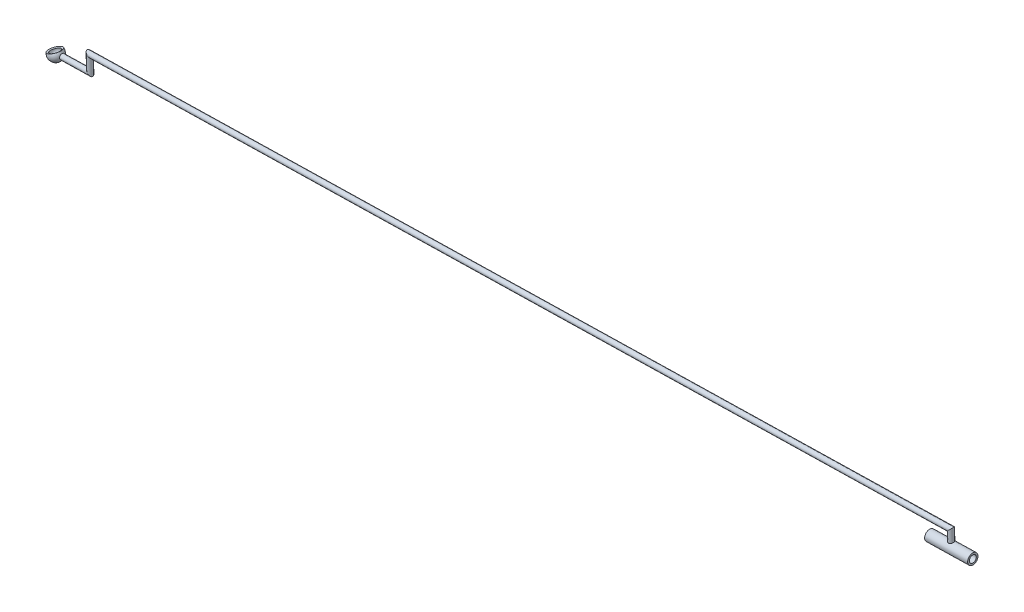
ISO-10303-21;
HEADER;
FILE_DESCRIPTION(('STEP AP214'),'2;1');
FILE_NAME('part.step','',(''),(''),'','','');
FILE_SCHEMA(('AUTOMOTIVE_DESIGN { 1 0 10303 214 1 1 1 1 }'));
ENDSEC;
DATA;
#1=APPLICATION_CONTEXT('core data for automotive mechanical design processes');
#2=APPLICATION_PROTOCOL_DEFINITION('international standard','automotive_design',2000,#1);
#3=PRODUCT_CONTEXT('',#1,'mechanical');
#4=PRODUCT('Part','Part','',(#3));
#5=PRODUCT_RELATED_PRODUCT_CATEGORY('part','',(#4));
#6=PRODUCT_DEFINITION_FORMATION('','',#4);
#7=PRODUCT_DEFINITION_CONTEXT('part definition',#1,'design');
#8=PRODUCT_DEFINITION('design','',#6,#7);
#9=PRODUCT_DEFINITION_SHAPE('','',#8);
#10=(LENGTH_UNIT() NAMED_UNIT(*) SI_UNIT(.MILLI.,.METRE.));
#11=(NAMED_UNIT(*) PLANE_ANGLE_UNIT() SI_UNIT($,.RADIAN.));
#12=(NAMED_UNIT(*) SI_UNIT($,.STERADIAN.) SOLID_ANGLE_UNIT());
#13=UNCERTAINTY_MEASURE_WITH_UNIT(LENGTH_MEASURE(1.E-05),#10,'distance_accuracy_value','');
#14=(GEOMETRIC_REPRESENTATION_CONTEXT(3) GLOBAL_UNCERTAINTY_ASSIGNED_CONTEXT((#13)) GLOBAL_UNIT_ASSIGNED_CONTEXT((#10,
#11,#12)) REPRESENTATION_CONTEXT('',''));
#15=CARTESIAN_POINT('',(0.,0.,0.));
#16=DIRECTION('',(0.,0.,1.));
#17=DIRECTION('',(1.,0.,0.));
#18=AXIS2_PLACEMENT_3D('',#15,#16,#17);
#19=CARTESIAN_POINT('',(-968.763398119366,-169.458929981982,0.));
#20=DIRECTION('',(-0.999750901456538,-0.0223189389720978,0.));
#21=DIRECTION('',(0.0223189389720978,-0.999750901456538,0.));
#22=AXIS2_PLACEMENT_3D('',#19,#20,#21);
#23=CYLINDRICAL_SURFACE('',#22,1.5);
#24=CARTESIAN_POINT('',(-973.004981970869,-169.553621220558,0.));
#25=DIRECTION('',(0.691148768821226,0.722712515013337,0.));
#26=DIRECTION('',(-0.722712515013337,0.691148768821226,0.));
#27=AXIS2_PLACEMENT_3D('',#24,#25,#26);
#28=ELLIPSE('',#27,2.12132034355963,1.5);
#29=CARTESIAN_POINT('',(-974.538086731512,-168.087473276831,0.));
#30=VERTEX_POINT('',#29);
#31=EDGE_CURVE('E64',#30,#30,#28,.T.);
#32=ORIENTED_EDGE('',*,*,#31,.F.);
#33=EDGE_LOOP('',(#32));
#34=FACE_BOUND('',#33,.T.);
#35=CARTESIAN_POINT('',(-989.292824438573,-169.917239159281,0.));
#36=DIRECTION('',(-0.999750901456547,-0.0223189389720992,0.));
#37=DIRECTION('',(0.022318938972099,-0.999750901456538,0.));
#38=AXIS2_PLACEMENT_3D('',#35,#36,#37);
#39=CIRCLE('',#38,1.5);
#40=CARTESIAN_POINT('',(-989.259346030114,-171.416865511466,0.));
#41=VERTEX_POINT('',#40);
#42=EDGE_CURVE('E12',#41,#41,#39,.T.);
#43=ORIENTED_EDGE('',*,*,#42,.F.);
#44=EDGE_LOOP('',(#43));
#45=FACE_BOUND('',#44,.T.);
#46=ADVANCED_FACE('F36',(#34,#45),#23,.T.);
#47=CARTESIAN_POINT('',(-485.626417510807,-158.673138471661,0.));
#48=DIRECTION('',(0.999750901456538,0.0223189389720969,0.));
#49=DIRECTION('',(-0.0223189389720969,0.999750901456538,0.));
#50=AXIS2_PLACEMENT_3D('',#47,#48,#49);
#51=PLANE('',#50);
#52=CARTESIAN_POINT('',(-485.626417510807,-158.673138471661,0.));
#53=DIRECTION('',(-0.999750901456538,-0.0223189389720969,0.));
#54=DIRECTION('',(0.0223189389720969,-0.999750901456538,0.));
#55=AXIS2_PLACEMENT_3D('',#52,#53,#54);
#56=CIRCLE('',#55,1.9999999999997);
#57=CARTESIAN_POINT('',(-485.581779632863,-160.672640274573,0.));
#58=VERTEX_POINT('',#57);
#59=EDGE_CURVE('E58',#58,#58,#56,.T.);
#60=ORIENTED_EDGE('',*,*,#59,.F.);
#61=EDGE_LOOP('',(#60));
#62=FACE_BOUND('',#61,.T.);
#63=CARTESIAN_POINT('',(-485.626417510807,-158.673138471661,0.));
#64=DIRECTION('',(-0.999750901456538,-0.0223189389720969,0.));
#65=DIRECTION('',(0.0223189389720969,-0.999750901456538,0.));
#66=AXIS2_PLACEMENT_3D('',#63,#64,#65);
#67=CIRCLE('',#66,3.0000000000001);
#68=CARTESIAN_POINT('',(-485.559460693891,-161.67239117603,0.));
#69=VERTEX_POINT('',#68);
#70=EDGE_CURVE('E43',#69,#69,#67,.T.);
#71=ORIENTED_EDGE('',*,*,#70,.T.);
#72=EDGE_LOOP('',(#71));
#73=FACE_BOUND('',#72,.T.);
#74=ADVANCED_FACE('F38',(#62,#73),#51,.F.);
#75=CARTESIAN_POINT('',(-485.626417510807,-158.673138471661,0.));
#76=DIRECTION('',(-0.999750901456538,-0.0223189389720969,0.));
#77=DIRECTION('',(0.0223189389720969,-0.999750901456538,0.));
#78=AXIS2_PLACEMENT_3D('',#75,#76,#77);
#79=CYLINDRICAL_SURFACE('',#78,3.00000000000011);
#80=CARTESIAN_POINT('',(-471.696861707332,-155.361420621681,0.));
#81=CARTESIAN_POINT('',(-471.696866563626,-155.361425030091,0.078857944426846));
#82=CARTESIAN_POINT('',(-471.703045118603,-155.364702080971,0.157809899546335));
#83=CARTESIAN_POINT('',(-471.727489874709,-155.377495873645,0.313380352903335));
#84=CARTESIAN_POINT('',(-471.745779031449,-155.387024464899,0.389994130070439));
#85=CARTESIAN_POINT('',(-471.793562201747,-155.411347119682,0.538400317320669));
#86=CARTESIAN_POINT('',(-471.823012670483,-155.426120706363,0.610210204408712));
#87=CARTESIAN_POINT('',(-471.89207466382,-155.459615380179,0.747708925209884));
#88=CARTESIAN_POINT('',(-471.931685387265,-155.47833615605,0.81339824098507));
#89=CARTESIAN_POINT('',(-472.022693074534,-155.519388307731,0.941261726642846));
#90=CARTESIAN_POINT('',(-472.074658105009,-155.54186959909,1.00298281668315));
#91=CARTESIAN_POINT('',(-472.18771961384,-155.587532819859,1.11716916730046));
#92=CARTESIAN_POINT('',(-472.248822985753,-155.610715267567,1.16962737466014));
#93=CARTESIAN_POINT('',(-472.38415311222,-155.657349684141,1.26787800067541));
#94=CARTESIAN_POINT('',(-472.459030109339,-155.680683135007,1.31283800332745));
#95=CARTESIAN_POINT('',(-472.616577366903,-155.722748023904,1.38925234033604));
#96=CARTESIAN_POINT('',(-472.699242008547,-155.741482745268,1.42071632244949));
#97=CARTESIAN_POINT('',(-472.86501507746,-155.770726517395,1.46719866328287));
#98=CARTESIAN_POINT('',(-472.947800676283,-155.781660859663,1.48308878562065));
#99=CARTESIAN_POINT('',(-473.115495982764,-155.795462803546,1.50064048996326));
#100=CARTESIAN_POINT('',(-473.200403508044,-155.7983383748,1.50231613255961));
#101=CARTESIAN_POINT('',(-473.359006274301,-155.795962214654,1.49203093075844));
#102=CARTESIAN_POINT('',(-473.432828112646,-155.791641262344,1.48167683930524));
#103=CARTESIAN_POINT('',(-473.577629797105,-155.777357548173,1.4504097735854));
#104=CARTESIAN_POINT('',(-473.648608730139,-155.767392989021,1.42949343584648));
#105=CARTESIAN_POINT('',(-473.787712709488,-155.74286906966,1.37731467057901));
#106=CARTESIAN_POINT('',(-473.855732770039,-155.728208089443,1.34582260067399));
#107=CARTESIAN_POINT('',(-473.985914948558,-155.696042150791,1.273562531502));
#108=CARTESIAN_POINT('',(-474.048074417494,-155.678535915925,1.23279036571869));
#109=CARTESIAN_POINT('',(-474.173041500392,-155.640058367074,1.13709908236916));
#110=CARTESIAN_POINT('',(-474.234931930218,-155.618929147541,1.08104168755389));
#111=CARTESIAN_POINT('',(-474.348803914433,-155.577448620713,0.95933336811202));
#112=CARTESIAN_POINT('',(-474.400780733152,-155.557097688895,0.893677884861395));
#113=CARTESIAN_POINT('',(-474.495583867788,-155.518394423482,0.750774758747749));
#114=CARTESIAN_POINT('',(-474.537873172835,-155.500178785225,0.673130387399092));
#115=CARTESIAN_POINT('',(-474.608330094418,-155.469060102951,0.510699323233184));
#116=CARTESIAN_POINT('',(-474.63650892405,-155.456152842016,0.425918364397912));
#117=CARTESIAN_POINT('',(-474.675606368403,-155.438057125905,0.259149737491061));
#118=CARTESIAN_POINT('',(-474.68776123738,-155.432317911656,0.177512295822498));
#119=CARTESIAN_POINT('',(-474.698335404854,-155.427331546392,0.0131693999240394));
#120=CARTESIAN_POINT('',(-474.696761210333,-155.428081319874,-0.0695355298048496));
#121=CARTESIAN_POINT('',(-474.680637852045,-155.435665949963,-0.226849457978967));
#122=CARTESIAN_POINT('',(-474.667103794455,-155.442024666584,-0.301589112074882));
#123=CARTESIAN_POINT('',(-474.629044730935,-155.459555711226,-0.4476103384529));
#124=CARTESIAN_POINT('',(-474.604518513301,-155.47072856992,-0.518891528536618));
#125=CARTESIAN_POINT('',(-474.544541840278,-155.49724788395,-0.658332912674351));
#126=CARTESIAN_POINT('',(-474.508799085156,-155.512704538469,-0.726345595508701));
#127=CARTESIAN_POINT('',(-474.427755298075,-155.546257696958,-0.855692042548903));
#128=CARTESIAN_POINT('',(-474.382450194373,-155.564355324463,-0.91702294466488));
#129=CARTESIAN_POINT('',(-474.278461719118,-155.603476170437,-1.03765153393381));
#130=CARTESIAN_POINT('',(-474.218901485183,-155.624612161545,-1.09615811672853));
#131=CARTESIAN_POINT('',(-474.090772631041,-155.66599016719,-1.20278448167828));
#132=CARTESIAN_POINT('',(-474.022197831489,-155.686231555656,-1.2508970785678));
#133=CARTESIAN_POINT('',(-473.873838734265,-155.724330956428,-1.33756187171851));
#134=CARTESIAN_POINT('',(-473.79367241077,-155.742026076236,-1.37553824370036));
#135=CARTESIAN_POINT('',(-473.626936258083,-155.77098877621,-1.43712423890205));
#136=CARTESIAN_POINT('',(-473.540374842171,-155.782264637137,-1.46075237380051));
#137=CARTESIAN_POINT('',(-473.372225544287,-155.795498577714,-1.4907925312003));
#138=CARTESIAN_POINT('',(-473.290957908067,-155.798247218394,-1.49863949460817));
#139=CARTESIAN_POINT('',(-473.128348385899,-155.795997818423,-1.50103373156431));
#140=CARTESIAN_POINT('',(-473.047006547419,-155.791003135954,-1.49558676993487));
#141=CARTESIAN_POINT('',(-472.89471109543,-155.774690363197,-1.47288918838996));
#142=CARTESIAN_POINT('',(-472.823506056675,-155.764019997836,-1.45681247151455));
#143=CARTESIAN_POINT('',(-472.684990746635,-155.738003176757,-1.41476303733662));
#144=CARTESIAN_POINT('',(-472.61768173623,-155.722655217177,-1.38878713673989));
#145=CARTESIAN_POINT('',(-472.483839630354,-155.687638438833,-1.32572361795085));
#146=CARTESIAN_POINT('',(-472.417662489554,-155.667748600265,-1.28800670672356));
#147=CARTESIAN_POINT('',(-472.292187628714,-155.626243657099,-1.20322645745609));
#148=CARTESIAN_POINT('',(-472.232893513282,-155.60462765843,-1.15615825686234));
#149=CARTESIAN_POINT('',(-472.115346003503,-155.558875085396,-1.04730498999205));
#150=CARTESIAN_POINT('',(-472.058094477731,-155.534751380679,-0.984426634495894));
#151=CARTESIAN_POINT('',(-471.954683116448,-155.489040427986,-0.849232209349815));
#152=CARTESIAN_POINT('',(-471.908529259423,-155.467454550363,-0.776911084957818));
#153=CARTESIAN_POINT('',(-471.828533758996,-155.428906069196,-0.623897395174437));
#154=CARTESIAN_POINT('',(-471.794781475222,-155.411977233175,-0.543149255665105));
#155=CARTESIAN_POINT('',(-471.741636447502,-155.384905676983,-0.376113151707123));
#156=CARTESIAN_POINT('',(-471.722202893087,-155.374743678368,-0.289841699383636));
#157=CARTESIAN_POINT('',(-471.70591135598,-155.366191860044,-0.168902919736324));
#158=CARTESIAN_POINT('',(-471.702522498234,-155.364407228384,-0.135242819162331));
#159=CARTESIAN_POINT('',(-471.697996599853,-155.362020646091,-0.0677275977076284));
#160=CARTESIAN_POINT('',(-471.69685962137,-155.361418728103,-0.0338724714699381));
#161=CARTESIAN_POINT('',(-471.696861707332,-155.361420621681,0.));
#162=B_SPLINE_CURVE_WITH_KNOTS('',3,(#80,#81,#82,#83,#84,#85,#86,#87,#88,#89,#90,#91,#92,#93,
#94,#95,#96,#97,#98,#99,#100,#101,#102,#103,#104,#105,#106,#107,#108,#109,#110,#111,#112,#113,
#114,#115,#116,#117,#118,#119,#120,#121,#122,#123,#124,#125,#126,#127,#128,#129,#130,#131,#132,
#133,#134,#135,#136,#137,#138,#139,#140,#141,#142,#143,#144,#145,#146,#147,#148,#149,#150,#151,
#152,#153,#154,#155,#156,#157,#158,#159,#160,#161),.UNSPECIFIED.,.T.,.F.,(4,2,2,2,2,2,2,2,2,2,2,
2,2,2,2,2,2,2,2,2,2,2,2,2,2,2,2,2,2,2,2,2,2,2,2,2,2,2,2,2,4),(0.,0.236436386130429,
0.473322224563789,0.709293233238439,0.945245640872349,1.19547263807714,1.44588935648105,
1.71572589646125,1.98536921847416,2.23887018210339,2.49212035993529,2.71508568613982,
2.93812205888513,3.16635360252732,3.39468781890338,3.65197412000821,3.90938301898031,
4.17874533321663,4.44789325368419,4.69474935707017,4.94148846767213,5.16910359759181,
5.39674382446396,5.63089284041849,5.8651417612251,6.12239415966624,6.37982382923146,
6.64972023242581,6.91926767918174,7.16293961254566,7.40650589797019,7.6268689537328,
7.84730293182526,8.08254685170427,8.31791341715448,8.58187864135755,8.84598575071864,
9.11196020495288,9.37717362931724,9.47872920200875,9.58028757766598),.UNSPECIFIED.);
#163=CARTESIAN_POINT('',(-471.696861707332,-155.361420621681,0.));
#164=VERTEX_POINT('',#163);
#165=EDGE_CURVE('E73',#164,#164,#162,.T.);
#166=ORIENTED_EDGE('',*,*,#165,.T.);
#167=EDGE_LOOP('',(#166));
#168=FACE_BOUND('',#167,.T.);
#169=ORIENTED_EDGE('',*,*,#70,.F.);
#170=EDGE_LOOP('',(#169));
#171=FACE_BOUND('',#170,.T.);
#172=CARTESIAN_POINT('',(-460.632644974394,-158.115164997358,0.));
#173=DIRECTION('',(-0.999750901456538,-0.0223189389720969,0.));
#174=DIRECTION('',(0.0223189389720969,-0.999750901456538,0.));
#175=AXIS2_PLACEMENT_3D('',#172,#173,#174);
#176=CIRCLE('',#175,3.00000000000012);
#177=CARTESIAN_POINT('',(-460.565688157477,-161.114417701728,0.));
#178=VERTEX_POINT('',#177);
#179=EDGE_CURVE('E74',#178,#178,#176,.T.);
#180=ORIENTED_EDGE('',*,*,#179,.T.);
#181=EDGE_LOOP('',(#180));
#182=FACE_BOUND('',#181,.T.);
#183=ADVANCED_FACE('F83',(#168,#171,#182),#79,.T.);
#184=CARTESIAN_POINT('',(-460.69960179131,-155.115912292988,0.));
#185=DIRECTION('',(-0.999750901456538,-0.0223189389720969,0.));
#186=DIRECTION('',(0.0223189389720969,-0.999750901456538,0.));
#187=AXIS2_PLACEMENT_3D('',#184,#185,#186);
#188=PLANE('',#187);
#189=CARTESIAN_POINT('',(-460.632644974394,-158.115164997358,0.));
#190=DIRECTION('',(-0.999750901456538,-0.0223189389720969,0.));
#191=DIRECTION('',(0.0223189389720969,-0.999750901456538,0.));
#192=AXIS2_PLACEMENT_3D('',#189,#190,#191);
#193=CIRCLE('',#192,1.9999999999997);
#194=CARTESIAN_POINT('',(-460.588007096449,-160.114666800271,0.));
#195=VERTEX_POINT('',#194);
#196=EDGE_CURVE('E63',#195,#195,#193,.T.);
#197=ORIENTED_EDGE('',*,*,#196,.T.);
#198=EDGE_LOOP('',(#197));
#199=FACE_BOUND('',#198,.T.);
#200=ORIENTED_EDGE('',*,*,#179,.F.);
#201=EDGE_LOOP('',(#200));
#202=FACE_BOUND('',#201,.T.);
#203=ADVANCED_FACE('F91',(#199,#202),#188,.F.);
#204=CARTESIAN_POINT('',(-473.330401693349,-149.396393621401,0.));
#205=DIRECTION('',(0.022318938972088,-0.999750901456538,0.));
#206=DIRECTION('',(0.999750901456538,0.022318938972088,0.));
#207=AXIS2_PLACEMENT_3D('',#204,#205,#206);
#208=CYLINDRICAL_SURFACE('',#207,1.5);
#209=CARTESIAN_POINT('',(-473.330401693349,-149.396393621401,0.));
#210=DIRECTION('',(0.722712515013337,-0.691148768821226,0.));
#211=DIRECTION('',(0.691148768821226,0.722712515013337,0.));
#212=AXIS2_PLACEMENT_3D('',#209,#210,#211);
#213=ELLIPSE('',#212,2.12132034355965,1.5);
#214=CARTESIAN_POINT('',(-471.864253749623,-147.863288860758,0.));
#215=VERTEX_POINT('',#214);
#216=EDGE_CURVE('E70',#215,#215,#213,.T.);
#217=ORIENTED_EDGE('',*,*,#216,.T.);
#218=EDGE_LOOP('',(#217));
#219=FACE_BOUND('',#218,.T.);
#220=ORIENTED_EDGE('',*,*,#165,.F.);
#221=EDGE_LOOP('',(#220));
#222=FACE_BOUND('',#221,.T.);
#223=ADVANCED_FACE('F86',(#219,#222),#208,.T.);
#224=CARTESIAN_POINT('',(-973.205852421618,-160.555863107449,0.));
#225=DIRECTION('',(0.999750901456538,0.0223189389720976,0.));
#226=DIRECTION('',(-0.0223189389720976,0.999750901456538,0.));
#227=AXIS2_PLACEMENT_3D('',#224,#225,#226);
#228=CYLINDRICAL_SURFACE('',#227,1.5);
#229=CARTESIAN_POINT('',(-973.205852421618,-160.555863107449,0.));
#230=DIRECTION('',(0.691148768821226,0.722712515013337,0.));
#231=DIRECTION('',(-0.722712515013337,0.691148768821226,0.));
#232=AXIS2_PLACEMENT_3D('',#229,#230,#231);
#233=ELLIPSE('',#232,2.12132034355963,1.5);
#234=CARTESIAN_POINT('',(-974.738957182261,-159.089715163723,0.));
#235=VERTEX_POINT('',#234);
#236=EDGE_CURVE('E67',#235,#235,#233,.F.);
#237=ORIENTED_EDGE('',*,*,#236,.F.);
#238=EDGE_LOOP('',(#237));
#239=FACE_BOUND('',#238,.T.);
#240=ORIENTED_EDGE('',*,*,#216,.F.);
#241=EDGE_LOOP('',(#240));
#242=FACE_BOUND('',#241,.T.);
#243=ADVANCED_FACE('F90',(#239,#242),#228,.T.);
#244=CARTESIAN_POINT('',(-973.004981970869,-169.553621220558,0.));
#245=DIRECTION('',(-0.0223189389720882,0.999750901456538,0.));
#246=DIRECTION('',(-0.999750901456538,-0.0223189389720882,0.));
#247=AXIS2_PLACEMENT_3D('',#244,#245,#246);
#248=CYLINDRICAL_SURFACE('',#247,1.5);
#249=ORIENTED_EDGE('',*,*,#31,.T.);
#250=EDGE_LOOP('',(#249));
#251=FACE_BOUND('',#250,.T.);
#252=ORIENTED_EDGE('',*,*,#236,.T.);
#253=EDGE_LOOP('',(#252));
#254=FACE_BOUND('',#253,.T.);
#255=ADVANCED_FACE('F114',(#251,#254),#248,.T.);
#256=CARTESIAN_POINT('',(-460.336967509658,-158.108564145805,0.));
#257=DIRECTION('',(-0.999750901456538,-0.0223189389720969,0.));
#258=DIRECTION('',(0.0223189389720969,-0.999750901456538,0.));
#259=AXIS2_PLACEMENT_3D('',#256,#257,#258);
#260=CYLINDRICAL_SURFACE('',#259,1.9999999999997);
#261=ORIENTED_EDGE('',*,*,#59,.T.);
#262=EDGE_LOOP('',(#261));
#263=FACE_BOUND('',#262,.T.);
#264=ORIENTED_EDGE('',*,*,#196,.F.);
#265=EDGE_LOOP('',(#264));
#266=FACE_BOUND('',#265,.T.);
#267=ADVANCED_FACE('F112',(#263,#266),#260,.F.);
#268=CARTESIAN_POINT('',(-993.,-170.,0.));
#269=DIRECTION('',(-0.362907888861987,0.931825018016653,0.));
#270=DIRECTION('',(-0.931825018016653,-0.362907888861987,0.));
#271=AXIS2_PLACEMENT_3D('',#268,#269,#270);
#272=SPHERICAL_SURFACE('',#271,4.00000000000001);
#273=CARTESIAN_POINT('',(-993.477109338761,-168.774944188783,0.));
#274=DIRECTION('',(-0.362907888861987,0.931825018016653,0.));
#275=DIRECTION('',(-0.931825018016653,-0.362907888861987,0.));
#276=AXIS2_PLACEMENT_3D('',#273,#274,#275);
#277=CIRCLE('',#276,3.77777777777784);
#278=CARTESIAN_POINT('',(-996.997337184601,-170.145929546707,0.));
#279=VERTEX_POINT('',#278);
#280=EDGE_CURVE('E55',#279,#279,#277,.T.);
#281=ORIENTED_EDGE('',*,*,#280,.F.);
#282=EDGE_LOOP('',(#281));
#283=FACE_BOUND('',#282,.T.);
#284=ORIENTED_EDGE('',*,*,#42,.T.);
#285=EDGE_LOOP('',(#284));
#286=FACE_BOUND('',#285,.T.);
#287=ADVANCED_FACE('F121',(#283,#286),#272,.T.);
#288=CARTESIAN_POINT('',(-993.35783200407,-169.081208141588,0.));
#289=DIRECTION('',(-0.362907888861987,0.931825018016653,0.));
#290=DIRECTION('',(-0.931825018016653,-0.362907888861987,0.));
#291=AXIS2_PLACEMENT_3D('',#288,#289,#290);
#292=CONICAL_SURFACE('',#291,2.83333333333333,1.23590016835554);
#293=ORIENTED_EDGE('',*,*,#280,.T.);
#294=EDGE_LOOP('',(#293));
#295=FACE_BOUND('',#294,.T.);
#296=CARTESIAN_POINT('',(-993.35783200407,-169.081208141588,0.));
#297=DIRECTION('',(-0.362907888861987,0.931825018016653,0.));
#298=DIRECTION('',(-0.931825018016653,-0.362907888861987,0.));
#299=AXIS2_PLACEMENT_3D('',#296,#297,#298);
#300=CIRCLE('',#299,2.83333333333336);
#301=CARTESIAN_POINT('',(-995.998002888451,-170.10944716003,0.));
#302=VERTEX_POINT('',#301);
#303=EDGE_CURVE('E53',#302,#302,#300,.T.);
#304=ORIENTED_EDGE('',*,*,#303,.F.);
#305=EDGE_LOOP('',(#304));
#306=FACE_BOUND('',#305,.T.);
#307=ADVANCED_FACE('F49',(#295,#306),#292,.F.);
#308=CARTESIAN_POINT('',(-993.,-170.,0.));
#309=DIRECTION('',(-0.362907888861987,0.931825018016653,0.));
#310=DIRECTION('',(-0.931825018016653,-0.362907888861987,0.));
#311=AXIS2_PLACEMENT_3D('',#308,#309,#310);
#312=SPHERICAL_SURFACE('',#311,3.00000000000001);
#313=CARTESIAN_POINT('',(-990.00074729563,-169.933043183084,0.));
#314=VERTEX_POINT('',#313);
#315=VERTEX_LOOP('',#314);
#316=FACE_BOUND('',#315,.T.);
#317=ORIENTED_EDGE('',*,*,#303,.T.);
#318=EDGE_LOOP('',(#317));
#319=FACE_BOUND('',#318,.T.);
#320=ADVANCED_FACE('F46',(#316,#319),#312,.F.);
#321=CLOSED_SHELL('',(#46,#74,#183,#203,#223,#243,#255,#267,#287,#307,#320));
#322=MANIFOLD_SOLID_BREP('B2',#321);
#323=ADVANCED_BREP_SHAPE_REPRESENTATION('',(#18,#322),#14);
#324=SHAPE_DEFINITION_REPRESENTATION(#9,#323);
ENDSEC;
END-ISO-10303-21;
